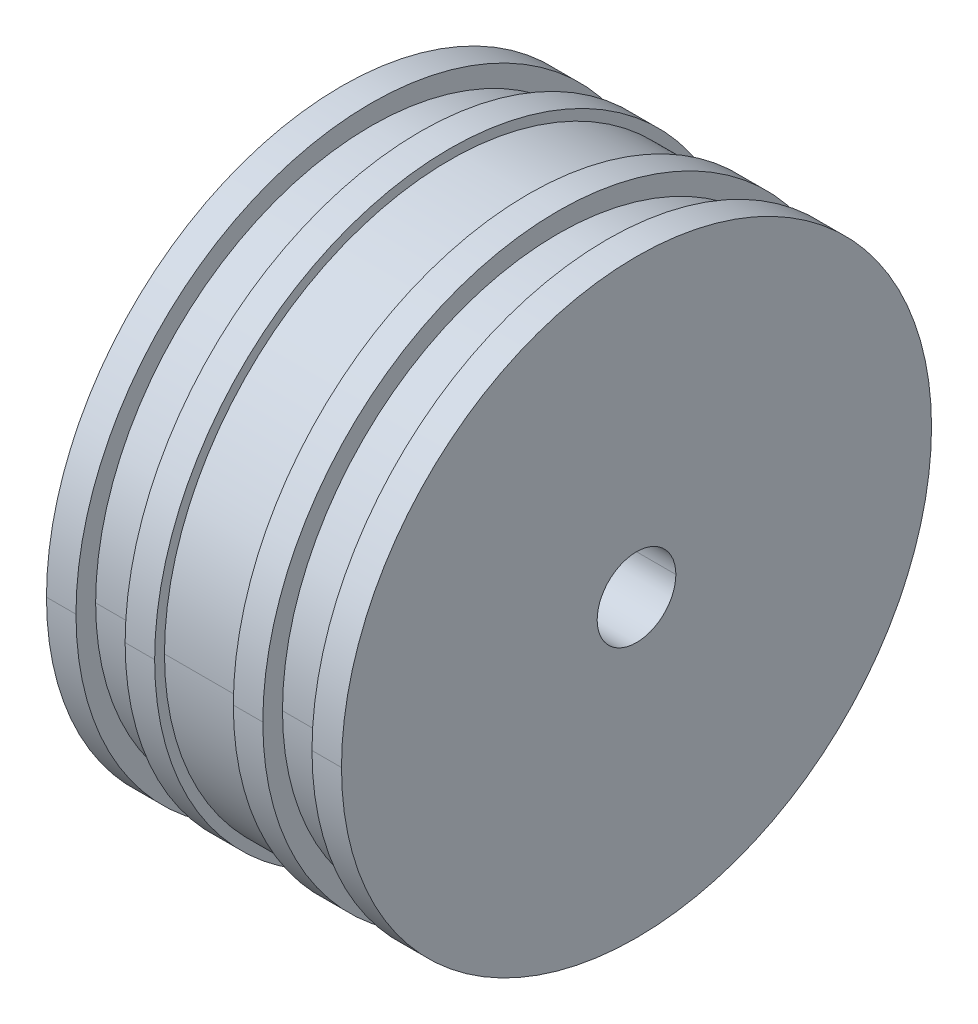
ISO-10303-21;
HEADER;
FILE_DESCRIPTION(('STEP AP214'),'2;1');
FILE_NAME('part.step','',(''),(''),'','','');
FILE_SCHEMA(('AUTOMOTIVE_DESIGN { 1 0 10303 214 1 1 1 1 }'));
ENDSEC;
DATA;
#1=APPLICATION_CONTEXT('core data for automotive mechanical design processes');
#2=APPLICATION_PROTOCOL_DEFINITION('international standard','automotive_design',2000,#1);
#3=PRODUCT_CONTEXT('',#1,'mechanical');
#4=PRODUCT('Part','Part','',(#3));
#5=PRODUCT_RELATED_PRODUCT_CATEGORY('part','',(#4));
#6=PRODUCT_DEFINITION_FORMATION('','',#4);
#7=PRODUCT_DEFINITION_CONTEXT('part definition',#1,'design');
#8=PRODUCT_DEFINITION('design','',#6,#7);
#9=PRODUCT_DEFINITION_SHAPE('','',#8);
#10=(LENGTH_UNIT() NAMED_UNIT(*) SI_UNIT(.MILLI.,.METRE.));
#11=(NAMED_UNIT(*) PLANE_ANGLE_UNIT() SI_UNIT($,.RADIAN.));
#12=(NAMED_UNIT(*) SI_UNIT($,.STERADIAN.) SOLID_ANGLE_UNIT());
#13=UNCERTAINTY_MEASURE_WITH_UNIT(LENGTH_MEASURE(1.E-05),#10,'distance_accuracy_value','');
#14=(GEOMETRIC_REPRESENTATION_CONTEXT(3) GLOBAL_UNCERTAINTY_ASSIGNED_CONTEXT((#13)) GLOBAL_UNIT_ASSIGNED_CONTEXT((#10,
#11,#12)) REPRESENTATION_CONTEXT('',''));
#15=CARTESIAN_POINT('',(0.,0.,0.));
#16=DIRECTION('',(0.,0.,1.));
#17=DIRECTION('',(1.,0.,0.));
#18=AXIS2_PLACEMENT_3D('',#15,#16,#17);
#19=CARTESIAN_POINT('',(-15.,0.,0.));
#20=DIRECTION('',(-1.,0.,0.));
#21=DIRECTION('',(0.,0.,1.));
#22=AXIS2_PLACEMENT_3D('',#19,#20,#21);
#23=CYLINDRICAL_SURFACE('',#22,4.);
#24=DIRECTION('',(-1.,0.,0.));
#25=VECTOR('',#24,1.);
#26=CARTESIAN_POINT('',(-15.,0.,-4.));
#27=LINE('',#26,#25);
#28=CARTESIAN_POINT('',(-10.,0.,-4.));
#29=VERTEX_POINT('',#28);
#30=CARTESIAN_POINT('',(-15.,0.,-4.));
#31=VERTEX_POINT('',#30);
#32=EDGE_CURVE('E280',#29,#31,#27,.T.);
#33=ORIENTED_EDGE('',*,*,#32,.F.);
#34=CARTESIAN_POINT('',(-10.,0.,0.));
#35=DIRECTION('',(-1.,0.,0.));
#36=DIRECTION('',(0.,0.,1.));
#37=AXIS2_PLACEMENT_3D('',#34,#35,#36);
#38=CIRCLE('',#37,4.);
#39=CARTESIAN_POINT('',(-10.,0.,4.));
#40=VERTEX_POINT('',#39);
#41=EDGE_CURVE('E11',#40,#29,#38,.T.);
#42=ORIENTED_EDGE('',*,*,#41,.F.);
#43=DIRECTION('',(-1.,0.,0.));
#44=VECTOR('',#43,1.);
#45=CARTESIAN_POINT('',(-15.,0.,4.));
#46=LINE('',#45,#44);
#47=CARTESIAN_POINT('',(-15.,0.,4.));
#48=VERTEX_POINT('',#47);
#49=EDGE_CURVE('E222',#40,#48,#46,.T.);
#50=ORIENTED_EDGE('',*,*,#49,.T.);
#51=CARTESIAN_POINT('',(-15.,0.,0.));
#52=DIRECTION('',(-1.,0.,0.));
#53=DIRECTION('',(0.,0.,1.));
#54=AXIS2_PLACEMENT_3D('',#51,#52,#53);
#55=CIRCLE('',#54,4.);
#56=EDGE_CURVE('E275',#48,#31,#55,.T.);
#57=ORIENTED_EDGE('',*,*,#56,.T.);
#58=EDGE_LOOP('',(#33,#42,#50,#57));
#59=FACE_BOUND('',#58,.T.);
#60=ADVANCED_FACE('F16',(#59),#23,.F.);
#61=CARTESIAN_POINT('',(-10.,4.,0.));
#62=DIRECTION('',(-1.,0.,0.));
#63=DIRECTION('',(0.,0.,1.));
#64=AXIS2_PLACEMENT_3D('',#61,#62,#63);
#65=PLANE('',#64);
#66=ORIENTED_EDGE('',*,*,#41,.T.);
#67=CARTESIAN_POINT('',(-10.,0.,0.));
#68=DIRECTION('',(-1.,0.,0.));
#69=DIRECTION('',(0.,0.,1.));
#70=AXIS2_PLACEMENT_3D('',#67,#68,#69);
#71=CIRCLE('',#70,4.);
#72=EDGE_CURVE('E277',#29,#40,#71,.T.);
#73=ORIENTED_EDGE('',*,*,#72,.T.);
#74=EDGE_LOOP('',(#66,#73));
#75=FACE_BOUND('',#74,.T.);
#76=CARTESIAN_POINT('',(-10.,0.,0.));
#77=DIRECTION('',(-1.,0.,0.));
#78=DIRECTION('',(0.,0.,1.));
#79=AXIS2_PLACEMENT_3D('',#76,#77,#78);
#80=CIRCLE('',#79,6.);
#81=CARTESIAN_POINT('',(-10.,0.,6.));
#82=VERTEX_POINT('',#81);
#83=CARTESIAN_POINT('',(-10.,0.,-6.));
#84=VERTEX_POINT('',#83);
#85=EDGE_CURVE('E27',#82,#84,#80,.T.);
#86=ORIENTED_EDGE('',*,*,#85,.F.);
#87=CARTESIAN_POINT('',(-10.,0.,0.));
#88=DIRECTION('',(-1.,0.,0.));
#89=DIRECTION('',(0.,0.,1.));
#90=AXIS2_PLACEMENT_3D('',#87,#88,#89);
#91=CIRCLE('',#90,6.);
#92=EDGE_CURVE('E251',#84,#82,#91,.T.);
#93=ORIENTED_EDGE('',*,*,#92,.F.);
#94=EDGE_LOOP('',(#86,#93));
#95=FACE_BOUND('',#94,.T.);
#96=ADVANCED_FACE('F442',(#75,#95),#65,.F.);
#97=CARTESIAN_POINT('',(-15.,0.,0.));
#98=DIRECTION('',(-1.,0.,0.));
#99=DIRECTION('',(0.,0.,1.));
#100=AXIS2_PLACEMENT_3D('',#97,#98,#99);
#101=CYLINDRICAL_SURFACE('',#100,6.);
#102=DIRECTION('',(-1.,0.,0.));
#103=VECTOR('',#102,1.);
#104=CARTESIAN_POINT('',(-15.,0.,-6.));
#105=LINE('',#104,#103);
#106=CARTESIAN_POINT('',(-8.,0.,-6.));
#107=VERTEX_POINT('',#106);
#108=EDGE_CURVE('E266',#107,#84,#105,.T.);
#109=ORIENTED_EDGE('',*,*,#108,.F.);
#110=CARTESIAN_POINT('',(-8.,0.,0.));
#111=DIRECTION('',(-1.,0.,0.));
#112=DIRECTION('',(0.,0.,1.));
#113=AXIS2_PLACEMENT_3D('',#110,#111,#112);
#114=CIRCLE('',#113,6.);
#115=CARTESIAN_POINT('',(-8.,0.,6.));
#116=VERTEX_POINT('',#115);
#117=EDGE_CURVE('E218',#116,#107,#114,.T.);
#118=ORIENTED_EDGE('',*,*,#117,.F.);
#119=DIRECTION('',(-1.,0.,0.));
#120=VECTOR('',#119,1.);
#121=CARTESIAN_POINT('',(-15.,0.,6.));
#122=LINE('',#121,#120);
#123=EDGE_CURVE('E246',#116,#82,#122,.T.);
#124=ORIENTED_EDGE('',*,*,#123,.T.);
#125=ORIENTED_EDGE('',*,*,#85,.T.);
#126=EDGE_LOOP('',(#109,#118,#124,#125));
#127=FACE_BOUND('',#126,.T.);
#128=ADVANCED_FACE('F448',(#127),#101,.F.);
#129=CARTESIAN_POINT('',(-8.,6.,0.));
#130=DIRECTION('',(1.,0.,0.));
#131=DIRECTION('',(0.,1.,0.));
#132=AXIS2_PLACEMENT_3D('',#129,#130,#131);
#133=PLANE('',#132);
#134=CARTESIAN_POINT('',(-8.,0.,0.));
#135=DIRECTION('',(-1.,0.,0.));
#136=DIRECTION('',(0.,0.,1.));
#137=AXIS2_PLACEMENT_3D('',#134,#135,#136);
#138=CIRCLE('',#137,4.);
#139=CARTESIAN_POINT('',(-8.,0.,4.));
#140=VERTEX_POINT('',#139);
#141=CARTESIAN_POINT('',(-8.,0.,-4.));
#142=VERTEX_POINT('',#141);
#143=EDGE_CURVE('E220',#140,#142,#138,.T.);
#144=ORIENTED_EDGE('',*,*,#143,.F.);
#145=CARTESIAN_POINT('',(-8.,0.,0.));
#146=DIRECTION('',(-1.,0.,0.));
#147=DIRECTION('',(0.,0.,1.));
#148=AXIS2_PLACEMENT_3D('',#145,#146,#147);
#149=CIRCLE('',#148,4.);
#150=EDGE_CURVE('E305',#142,#140,#149,.T.);
#151=ORIENTED_EDGE('',*,*,#150,.F.);
#152=EDGE_LOOP('',(#144,#151));
#153=FACE_BOUND('',#152,.T.);
#154=ORIENTED_EDGE('',*,*,#117,.T.);
#155=CARTESIAN_POINT('',(-8.,0.,0.));
#156=DIRECTION('',(-1.,0.,0.));
#157=DIRECTION('',(0.,0.,1.));
#158=AXIS2_PLACEMENT_3D('',#155,#156,#157);
#159=CIRCLE('',#158,6.);
#160=EDGE_CURVE('E226',#107,#116,#159,.T.);
#161=ORIENTED_EDGE('',*,*,#160,.T.);
#162=EDGE_LOOP('',(#154,#161));
#163=FACE_BOUND('',#162,.T.);
#164=ADVANCED_FACE('F572',(#153,#163),#133,.F.);
#165=CARTESIAN_POINT('',(-15.,0.,0.));
#166=DIRECTION('',(-1.,0.,0.));
#167=DIRECTION('',(0.,0.,1.));
#168=AXIS2_PLACEMENT_3D('',#165,#166,#167);
#169=CYLINDRICAL_SURFACE('',#168,4.);
#170=DIRECTION('',(-1.,0.,0.));
#171=VECTOR('',#170,1.);
#172=CARTESIAN_POINT('',(-15.,0.,-4.));
#173=LINE('',#172,#171);
#174=CARTESIAN_POINT('',(15.,0.,-4.));
#175=VERTEX_POINT('',#174);
#176=EDGE_CURVE('E301',#175,#142,#173,.T.);
#177=ORIENTED_EDGE('',*,*,#176,.F.);
#178=CARTESIAN_POINT('',(15.,0.,0.));
#179=DIRECTION('',(-1.,0.,0.));
#180=DIRECTION('',(0.,0.,1.));
#181=AXIS2_PLACEMENT_3D('',#178,#179,#180);
#182=CIRCLE('',#181,4.);
#183=CARTESIAN_POINT('',(15.,0.,4.));
#184=VERTEX_POINT('',#183);
#185=EDGE_CURVE('E284',#184,#175,#182,.T.);
#186=ORIENTED_EDGE('',*,*,#185,.F.);
#187=DIRECTION('',(-1.,0.,0.));
#188=VECTOR('',#187,1.);
#189=CARTESIAN_POINT('',(-15.,0.,4.));
#190=LINE('',#189,#188);
#191=EDGE_CURVE('E351',#184,#140,#190,.T.);
#192=ORIENTED_EDGE('',*,*,#191,.T.);
#193=ORIENTED_EDGE('',*,*,#143,.T.);
#194=EDGE_LOOP('',(#177,#186,#192,#193));
#195=FACE_BOUND('',#194,.T.);
#196=ADVANCED_FACE('F574',(#195),#169,.F.);
#197=CARTESIAN_POINT('',(15.,30.,0.));
#198=DIRECTION('',(-1.,0.,0.));
#199=DIRECTION('',(0.,0.,1.));
#200=AXIS2_PLACEMENT_3D('',#197,#198,#199);
#201=PLANE('',#200);
#202=ORIENTED_EDGE('',*,*,#185,.T.);
#203=CARTESIAN_POINT('',(15.,0.,0.));
#204=DIRECTION('',(-1.,0.,0.));
#205=DIRECTION('',(0.,0.,1.));
#206=AXIS2_PLACEMENT_3D('',#203,#204,#205);
#207=CIRCLE('',#206,4.);
#208=EDGE_CURVE('E250',#175,#184,#207,.T.);
#209=ORIENTED_EDGE('',*,*,#208,.T.);
#210=EDGE_LOOP('',(#202,#209));
#211=FACE_BOUND('',#210,.T.);
#212=CARTESIAN_POINT('',(15.,0.,0.));
#213=DIRECTION('',(-1.,0.,0.));
#214=DIRECTION('',(0.,0.,1.));
#215=AXIS2_PLACEMENT_3D('',#212,#213,#214);
#216=CIRCLE('',#215,30.);
#217=CARTESIAN_POINT('',(15.,0.,30.));
#218=VERTEX_POINT('',#217);
#219=CARTESIAN_POINT('',(15.,0.,-30.));
#220=VERTEX_POINT('',#219);
#221=EDGE_CURVE('E385',#218,#220,#216,.T.);
#222=ORIENTED_EDGE('',*,*,#221,.F.);
#223=CARTESIAN_POINT('',(15.,0.,0.));
#224=DIRECTION('',(-1.,0.,0.));
#225=DIRECTION('',(0.,0.,1.));
#226=AXIS2_PLACEMENT_3D('',#223,#224,#225);
#227=CIRCLE('',#226,30.);
#228=EDGE_CURVE('E287',#220,#218,#227,.T.);
#229=ORIENTED_EDGE('',*,*,#228,.F.);
#230=EDGE_LOOP('',(#222,#229));
#231=FACE_BOUND('',#230,.T.);
#232=ADVANCED_FACE('F462',(#211,#231),#201,.F.);
#233=CARTESIAN_POINT('',(-15.,0.,0.));
#234=DIRECTION('',(-1.,0.,0.));
#235=DIRECTION('',(0.,0.,1.));
#236=AXIS2_PLACEMENT_3D('',#233,#234,#235);
#237=CYLINDRICAL_SURFACE('',#236,30.);
#238=DIRECTION('',(-1.,0.,0.));
#239=VECTOR('',#238,1.);
#240=CARTESIAN_POINT('',(-15.,0.,-30.));
#241=LINE('',#240,#239);
#242=CARTESIAN_POINT('',(12.,0.,-30.));
#243=VERTEX_POINT('',#242);
#244=EDGE_CURVE('E341',#220,#243,#241,.T.);
#245=ORIENTED_EDGE('',*,*,#244,.F.);
#246=ORIENTED_EDGE('',*,*,#228,.T.);
#247=DIRECTION('',(-1.,0.,0.));
#248=VECTOR('',#247,1.);
#249=CARTESIAN_POINT('',(-15.,0.,30.));
#250=LINE('',#249,#248);
#251=CARTESIAN_POINT('',(12.,0.,30.));
#252=VERTEX_POINT('',#251);
#253=EDGE_CURVE('E232',#218,#252,#250,.T.);
#254=ORIENTED_EDGE('',*,*,#253,.T.);
#255=CARTESIAN_POINT('',(12.,0.,0.));
#256=DIRECTION('',(-1.,0.,0.));
#257=DIRECTION('',(0.,0.,1.));
#258=AXIS2_PLACEMENT_3D('',#255,#256,#257);
#259=CIRCLE('',#258,30.);
#260=EDGE_CURVE('E212',#243,#252,#259,.T.);
#261=ORIENTED_EDGE('',*,*,#260,.F.);
#262=EDGE_LOOP('',(#245,#246,#254,#261));
#263=FACE_BOUND('',#262,.T.);
#264=ADVANCED_FACE('F459',(#263),#237,.T.);
#265=CARTESIAN_POINT('',(12.,28.,0.));
#266=DIRECTION('',(1.,0.,0.));
#267=DIRECTION('',(0.,1.,0.));
#268=AXIS2_PLACEMENT_3D('',#265,#266,#267);
#269=PLANE('',#268);
#270=CARTESIAN_POINT('',(12.,0.,0.));
#271=DIRECTION('',(-1.,0.,0.));
#272=DIRECTION('',(0.,0.,1.));
#273=AXIS2_PLACEMENT_3D('',#270,#271,#272);
#274=CIRCLE('',#273,28.);
#275=CARTESIAN_POINT('',(12.,0.,28.));
#276=VERTEX_POINT('',#275);
#277=CARTESIAN_POINT('',(12.,0.,-28.));
#278=VERTEX_POINT('',#277);
#279=EDGE_CURVE('E228',#276,#278,#274,.T.);
#280=ORIENTED_EDGE('',*,*,#279,.F.);
#281=CARTESIAN_POINT('',(12.,0.,0.));
#282=DIRECTION('',(-1.,0.,0.));
#283=DIRECTION('',(0.,0.,1.));
#284=AXIS2_PLACEMENT_3D('',#281,#282,#283);
#285=CIRCLE('',#284,28.);
#286=EDGE_CURVE('E265',#278,#276,#285,.T.);
#287=ORIENTED_EDGE('',*,*,#286,.F.);
#288=EDGE_LOOP('',(#280,#287));
#289=FACE_BOUND('',#288,.T.);
#290=CARTESIAN_POINT('',(12.,0.,0.));
#291=DIRECTION('',(-1.,0.,0.));
#292=DIRECTION('',(0.,0.,1.));
#293=AXIS2_PLACEMENT_3D('',#290,#291,#292);
#294=CIRCLE('',#293,30.);
#295=EDGE_CURVE('E236',#252,#243,#294,.T.);
#296=ORIENTED_EDGE('',*,*,#295,.T.);
#297=ORIENTED_EDGE('',*,*,#260,.T.);
#298=EDGE_LOOP('',(#296,#297));
#299=FACE_BOUND('',#298,.T.);
#300=ADVANCED_FACE('F437',(#289,#299),#269,.F.);
#301=CARTESIAN_POINT('',(-15.,0.,0.));
#302=DIRECTION('',(-1.,0.,0.));
#303=DIRECTION('',(0.,0.,1.));
#304=AXIS2_PLACEMENT_3D('',#301,#302,#303);
#305=CYLINDRICAL_SURFACE('',#304,28.);
#306=DIRECTION('',(-1.,0.,0.));
#307=VECTOR('',#306,1.);
#308=CARTESIAN_POINT('',(-15.,0.,-28.));
#309=LINE('',#308,#307);
#310=CARTESIAN_POINT('',(7.,0.,-28.));
#311=VERTEX_POINT('',#310);
#312=EDGE_CURVE('E20',#278,#311,#309,.T.);
#313=ORIENTED_EDGE('',*,*,#312,.F.);
#314=ORIENTED_EDGE('',*,*,#286,.T.);
#315=DIRECTION('',(-1.,0.,0.));
#316=VECTOR('',#315,1.);
#317=CARTESIAN_POINT('',(-15.,0.,28.));
#318=LINE('',#317,#316);
#319=CARTESIAN_POINT('',(7.,0.,28.));
#320=VERTEX_POINT('',#319);
#321=EDGE_CURVE('E310',#276,#320,#318,.T.);
#322=ORIENTED_EDGE('',*,*,#321,.T.);
#323=CARTESIAN_POINT('',(7.,0.,0.));
#324=DIRECTION('',(-1.,0.,0.));
#325=DIRECTION('',(0.,0.,1.));
#326=AXIS2_PLACEMENT_3D('',#323,#324,#325);
#327=CIRCLE('',#326,28.);
#328=EDGE_CURVE('E262',#311,#320,#327,.T.);
#329=ORIENTED_EDGE('',*,*,#328,.F.);
#330=EDGE_LOOP('',(#313,#314,#322,#329));
#331=FACE_BOUND('',#330,.T.);
#332=ADVANCED_FACE('F427',(#331),#305,.T.);
#333=CARTESIAN_POINT('',(7.,30.,0.));
#334=DIRECTION('',(-1.,0.,0.));
#335=DIRECTION('',(0.,0.,1.));
#336=AXIS2_PLACEMENT_3D('',#333,#334,#335);
#337=PLANE('',#336);
#338=CARTESIAN_POINT('',(7.,0.,0.));
#339=DIRECTION('',(-1.,0.,0.));
#340=DIRECTION('',(0.,0.,1.));
#341=AXIS2_PLACEMENT_3D('',#338,#339,#340);
#342=CIRCLE('',#341,28.);
#343=EDGE_CURVE('E306',#320,#311,#342,.T.);
#344=ORIENTED_EDGE('',*,*,#343,.T.);
#345=ORIENTED_EDGE('',*,*,#328,.T.);
#346=EDGE_LOOP('',(#344,#345));
#347=FACE_BOUND('',#346,.T.);
#348=CARTESIAN_POINT('',(7.,0.,0.));
#349=DIRECTION('',(-1.,0.,0.));
#350=DIRECTION('',(0.,0.,1.));
#351=AXIS2_PLACEMENT_3D('',#348,#349,#350);
#352=CIRCLE('',#351,30.);
#353=CARTESIAN_POINT('',(7.,0.,30.));
#354=VERTEX_POINT('',#353);
#355=CARTESIAN_POINT('',(7.,0.,-30.));
#356=VERTEX_POINT('',#355);
#357=EDGE_CURVE('E338',#354,#356,#352,.T.);
#358=ORIENTED_EDGE('',*,*,#357,.F.);
#359=CARTESIAN_POINT('',(7.,0.,0.));
#360=DIRECTION('',(-1.,0.,0.));
#361=DIRECTION('',(0.,0.,1.));
#362=AXIS2_PLACEMENT_3D('',#359,#360,#361);
#363=CIRCLE('',#362,30.);
#364=EDGE_CURVE('E216',#356,#354,#363,.T.);
#365=ORIENTED_EDGE('',*,*,#364,.F.);
#366=EDGE_LOOP('',(#358,#365));
#367=FACE_BOUND('',#366,.T.);
#368=ADVANCED_FACE('F425',(#347,#367),#337,.F.);
#369=CARTESIAN_POINT('',(-15.,0.,0.));
#370=DIRECTION('',(-1.,0.,0.));
#371=DIRECTION('',(0.,0.,1.));
#372=AXIS2_PLACEMENT_3D('',#369,#370,#371);
#373=CYLINDRICAL_SURFACE('',#372,30.);
#374=DIRECTION('',(-1.,0.,0.));
#375=VECTOR('',#374,1.);
#376=CARTESIAN_POINT('',(-15.,0.,-30.));
#377=LINE('',#376,#375);
#378=CARTESIAN_POINT('',(4.,0.,-30.));
#379=VERTEX_POINT('',#378);
#380=EDGE_CURVE('E300',#356,#379,#377,.T.);
#381=ORIENTED_EDGE('',*,*,#380,.F.);
#382=ORIENTED_EDGE('',*,*,#364,.T.);
#383=DIRECTION('',(-1.,0.,0.));
#384=VECTOR('',#383,1.);
#385=CARTESIAN_POINT('',(-15.,0.,30.));
#386=LINE('',#385,#384);
#387=CARTESIAN_POINT('',(4.,0.,30.));
#388=VERTEX_POINT('',#387);
#389=EDGE_CURVE('E299',#354,#388,#386,.T.);
#390=ORIENTED_EDGE('',*,*,#389,.T.);
#391=CARTESIAN_POINT('',(4.,0.,0.));
#392=DIRECTION('',(-1.,0.,0.));
#393=DIRECTION('',(0.,0.,1.));
#394=AXIS2_PLACEMENT_3D('',#391,#392,#393);
#395=CIRCLE('',#394,30.);
#396=EDGE_CURVE('E214',#379,#388,#395,.T.);
#397=ORIENTED_EDGE('',*,*,#396,.F.);
#398=EDGE_LOOP('',(#381,#382,#390,#397));
#399=FACE_BOUND('',#398,.T.);
#400=ADVANCED_FACE('F416',(#399),#373,.T.);
#401=CARTESIAN_POINT('',(4.,29.,0.));
#402=DIRECTION('',(1.,0.,0.));
#403=DIRECTION('',(0.,1.,0.));
#404=AXIS2_PLACEMENT_3D('',#401,#402,#403);
#405=PLANE('',#404);
#406=CARTESIAN_POINT('',(4.,0.,0.));
#407=DIRECTION('',(-1.,0.,0.));
#408=DIRECTION('',(0.,0.,1.));
#409=AXIS2_PLACEMENT_3D('',#406,#407,#408);
#410=CIRCLE('',#409,29.);
#411=CARTESIAN_POINT('',(4.,0.,29.));
#412=VERTEX_POINT('',#411);
#413=CARTESIAN_POINT('',(4.,0.,-29.));
#414=VERTEX_POINT('',#413);
#415=EDGE_CURVE('E242',#412,#414,#410,.T.);
#416=ORIENTED_EDGE('',*,*,#415,.F.);
#417=CARTESIAN_POINT('',(4.,0.,0.));
#418=DIRECTION('',(-1.,0.,0.));
#419=DIRECTION('',(0.,0.,1.));
#420=AXIS2_PLACEMENT_3D('',#417,#418,#419);
#421=CIRCLE('',#420,29.);
#422=EDGE_CURVE('E217',#414,#412,#421,.T.);
#423=ORIENTED_EDGE('',*,*,#422,.F.);
#424=EDGE_LOOP('',(#416,#423));
#425=FACE_BOUND('',#424,.T.);
#426=CARTESIAN_POINT('',(4.,0.,0.));
#427=DIRECTION('',(-1.,0.,0.));
#428=DIRECTION('',(0.,0.,1.));
#429=AXIS2_PLACEMENT_3D('',#426,#427,#428);
#430=CIRCLE('',#429,30.);
#431=EDGE_CURVE('E295',#388,#379,#430,.T.);
#432=ORIENTED_EDGE('',*,*,#431,.T.);
#433=ORIENTED_EDGE('',*,*,#396,.T.);
#434=EDGE_LOOP('',(#432,#433));
#435=FACE_BOUND('',#434,.T.);
#436=ADVANCED_FACE('F435',(#425,#435),#405,.F.);
#437=CARTESIAN_POINT('',(-15.,0.,0.));
#438=DIRECTION('',(-1.,0.,0.));
#439=DIRECTION('',(0.,0.,1.));
#440=AXIS2_PLACEMENT_3D('',#437,#438,#439);
#441=CYLINDRICAL_SURFACE('',#440,29.);
#442=DIRECTION('',(-1.,0.,0.));
#443=VECTOR('',#442,1.);
#444=CARTESIAN_POINT('',(-15.,0.,-29.));
#445=LINE('',#444,#443);
#446=CARTESIAN_POINT('',(-4.,0.,-29.));
#447=VERTEX_POINT('',#446);
#448=EDGE_CURVE('E237',#414,#447,#445,.T.);
#449=ORIENTED_EDGE('',*,*,#448,.F.);
#450=ORIENTED_EDGE('',*,*,#422,.T.);
#451=DIRECTION('',(-1.,0.,0.));
#452=VECTOR('',#451,1.);
#453=CARTESIAN_POINT('',(-15.,0.,29.));
#454=LINE('',#453,#452);
#455=CARTESIAN_POINT('',(-4.,0.,29.));
#456=VERTEX_POINT('',#455);
#457=EDGE_CURVE('E272',#412,#456,#454,.T.);
#458=ORIENTED_EDGE('',*,*,#457,.T.);
#459=CARTESIAN_POINT('',(-4.,0.,0.));
#460=DIRECTION('',(-1.,0.,0.));
#461=DIRECTION('',(0.,0.,1.));
#462=AXIS2_PLACEMENT_3D('',#459,#460,#461);
#463=CIRCLE('',#462,29.);
#464=EDGE_CURVE('E168',#447,#456,#463,.T.);
#465=ORIENTED_EDGE('',*,*,#464,.F.);
#466=EDGE_LOOP('',(#449,#450,#458,#465));
#467=FACE_BOUND('',#466,.T.);
#468=ADVANCED_FACE('F18',(#467),#441,.T.);
#469=CARTESIAN_POINT('',(-4.,30.,0.));
#470=DIRECTION('',(-1.,0.,0.));
#471=DIRECTION('',(0.,0.,1.));
#472=AXIS2_PLACEMENT_3D('',#469,#470,#471);
#473=PLANE('',#472);
#474=CARTESIAN_POINT('',(-4.,0.,0.));
#475=DIRECTION('',(-1.,0.,0.));
#476=DIRECTION('',(0.,0.,1.));
#477=AXIS2_PLACEMENT_3D('',#474,#475,#476);
#478=CIRCLE('',#477,29.);
#479=EDGE_CURVE('E241',#456,#447,#478,.T.);
#480=ORIENTED_EDGE('',*,*,#479,.T.);
#481=ORIENTED_EDGE('',*,*,#464,.T.);
#482=EDGE_LOOP('',(#480,#481));
#483=FACE_BOUND('',#482,.T.);
#484=CARTESIAN_POINT('',(-4.,0.,0.));
#485=DIRECTION('',(-1.,0.,0.));
#486=DIRECTION('',(0.,0.,1.));
#487=AXIS2_PLACEMENT_3D('',#484,#485,#486);
#488=CIRCLE('',#487,30.);
#489=CARTESIAN_POINT('',(-4.,0.,30.));
#490=VERTEX_POINT('',#489);
#491=CARTESIAN_POINT('',(-4.,0.,-30.));
#492=VERTEX_POINT('',#491);
#493=EDGE_CURVE('E312',#490,#492,#488,.T.);
#494=ORIENTED_EDGE('',*,*,#493,.F.);
#495=CARTESIAN_POINT('',(-4.,0.,0.));
#496=DIRECTION('',(-1.,0.,0.));
#497=DIRECTION('',(0.,0.,1.));
#498=AXIS2_PLACEMENT_3D('',#495,#496,#497);
#499=CIRCLE('',#498,30.);
#500=EDGE_CURVE('E155',#492,#490,#499,.T.);
#501=ORIENTED_EDGE('',*,*,#500,.F.);
#502=EDGE_LOOP('',(#494,#501));
#503=FACE_BOUND('',#502,.T.);
#504=ADVANCED_FACE('F478',(#483,#503),#473,.F.);
#505=CARTESIAN_POINT('',(-15.,0.,0.));
#506=DIRECTION('',(-1.,0.,0.));
#507=DIRECTION('',(0.,0.,1.));
#508=AXIS2_PLACEMENT_3D('',#505,#506,#507);
#509=CYLINDRICAL_SURFACE('',#508,30.);
#510=DIRECTION('',(-1.,0.,0.));
#511=VECTOR('',#510,1.);
#512=CARTESIAN_POINT('',(-15.,0.,-30.));
#513=LINE('',#512,#511);
#514=CARTESIAN_POINT('',(-7.,0.,-30.));
#515=VERTEX_POINT('',#514);
#516=EDGE_CURVE('E261',#492,#515,#513,.T.);
#517=ORIENTED_EDGE('',*,*,#516,.F.);
#518=ORIENTED_EDGE('',*,*,#500,.T.);
#519=DIRECTION('',(-1.,0.,0.));
#520=VECTOR('',#519,1.);
#521=CARTESIAN_POINT('',(-15.,0.,30.));
#522=LINE('',#521,#520);
#523=CARTESIAN_POINT('',(-7.,0.,30.));
#524=VERTEX_POINT('',#523);
#525=EDGE_CURVE('E260',#490,#524,#522,.T.);
#526=ORIENTED_EDGE('',*,*,#525,.T.);
#527=CARTESIAN_POINT('',(-7.,0.,0.));
#528=DIRECTION('',(-1.,0.,0.));
#529=DIRECTION('',(0.,0.,1.));
#530=AXIS2_PLACEMENT_3D('',#527,#528,#529);
#531=CIRCLE('',#530,30.);
#532=EDGE_CURVE('E245',#515,#524,#531,.T.);
#533=ORIENTED_EDGE('',*,*,#532,.F.);
#534=EDGE_LOOP('',(#517,#518,#526,#533));
#535=FACE_BOUND('',#534,.T.);
#536=ADVANCED_FACE('F470',(#535),#509,.T.);
#537=CARTESIAN_POINT('',(-7.,28.,0.));
#538=DIRECTION('',(1.,0.,0.));
#539=DIRECTION('',(0.,1.,0.));
#540=AXIS2_PLACEMENT_3D('',#537,#538,#539);
#541=PLANE('',#540);
#542=CARTESIAN_POINT('',(-7.,0.,0.));
#543=DIRECTION('',(-1.,0.,0.));
#544=DIRECTION('',(0.,0.,1.));
#545=AXIS2_PLACEMENT_3D('',#542,#543,#544);
#546=CIRCLE('',#545,28.);
#547=CARTESIAN_POINT('',(-7.,0.,28.));
#548=VERTEX_POINT('',#547);
#549=CARTESIAN_POINT('',(-7.,0.,-28.));
#550=VERTEX_POINT('',#549);
#551=EDGE_CURVE('E208',#548,#550,#546,.T.);
#552=ORIENTED_EDGE('',*,*,#551,.F.);
#553=CARTESIAN_POINT('',(-7.,0.,0.));
#554=DIRECTION('',(-1.,0.,0.));
#555=DIRECTION('',(0.,0.,1.));
#556=AXIS2_PLACEMENT_3D('',#553,#554,#555);
#557=CIRCLE('',#556,28.);
#558=EDGE_CURVE('E187',#550,#548,#557,.T.);
#559=ORIENTED_EDGE('',*,*,#558,.F.);
#560=EDGE_LOOP('',(#552,#559));
#561=FACE_BOUND('',#560,.T.);
#562=CARTESIAN_POINT('',(-7.,0.,0.));
#563=DIRECTION('',(-1.,0.,0.));
#564=DIRECTION('',(0.,0.,1.));
#565=AXIS2_PLACEMENT_3D('',#562,#563,#564);
#566=CIRCLE('',#565,30.);
#567=EDGE_CURVE('E256',#524,#515,#566,.T.);
#568=ORIENTED_EDGE('',*,*,#567,.T.);
#569=ORIENTED_EDGE('',*,*,#532,.T.);
#570=EDGE_LOOP('',(#568,#569));
#571=FACE_BOUND('',#570,.T.);
#572=ADVANCED_FACE('F468',(#561,#571),#541,.F.);
#573=CARTESIAN_POINT('',(-15.,0.,0.));
#574=DIRECTION('',(-1.,0.,0.));
#575=DIRECTION('',(0.,0.,1.));
#576=AXIS2_PLACEMENT_3D('',#573,#574,#575);
#577=CYLINDRICAL_SURFACE('',#576,28.);
#578=DIRECTION('',(-1.,0.,0.));
#579=VECTOR('',#578,1.);
#580=CARTESIAN_POINT('',(-15.,0.,-28.));
#581=LINE('',#580,#579);
#582=CARTESIAN_POINT('',(-12.,0.,-28.));
#583=VERTEX_POINT('',#582);
#584=EDGE_CURVE('E200',#550,#583,#581,.T.);
#585=ORIENTED_EDGE('',*,*,#584,.F.);
#586=ORIENTED_EDGE('',*,*,#558,.T.);
#587=DIRECTION('',(-1.,0.,0.));
#588=VECTOR('',#587,1.);
#589=CARTESIAN_POINT('',(-15.,0.,28.));
#590=LINE('',#589,#588);
#591=CARTESIAN_POINT('',(-12.,0.,28.));
#592=VERTEX_POINT('',#591);
#593=EDGE_CURVE('E191',#548,#592,#590,.T.);
#594=ORIENTED_EDGE('',*,*,#593,.T.);
#595=CARTESIAN_POINT('',(-12.,0.,0.));
#596=DIRECTION('',(-1.,0.,0.));
#597=DIRECTION('',(0.,0.,1.));
#598=AXIS2_PLACEMENT_3D('',#595,#596,#597);
#599=CIRCLE('',#598,28.);
#600=EDGE_CURVE('E177',#583,#592,#599,.T.);
#601=ORIENTED_EDGE('',*,*,#600,.F.);
#602=EDGE_LOOP('',(#585,#586,#594,#601));
#603=FACE_BOUND('',#602,.T.);
#604=ADVANCED_FACE('F192',(#603),#577,.T.);
#605=CARTESIAN_POINT('',(-12.,30.,0.));
#606=DIRECTION('',(-1.,0.,0.));
#607=DIRECTION('',(0.,0.,1.));
#608=AXIS2_PLACEMENT_3D('',#605,#606,#607);
#609=PLANE('',#608);
#610=CARTESIAN_POINT('',(-12.,0.,0.));
#611=DIRECTION('',(-1.,0.,0.));
#612=DIRECTION('',(0.,0.,1.));
#613=AXIS2_PLACEMENT_3D('',#610,#611,#612);
#614=CIRCLE('',#613,28.);
#615=EDGE_CURVE('E182',#592,#583,#614,.T.);
#616=ORIENTED_EDGE('',*,*,#615,.T.);
#617=ORIENTED_EDGE('',*,*,#600,.T.);
#618=EDGE_LOOP('',(#616,#617));
#619=FACE_BOUND('',#618,.T.);
#620=CARTESIAN_POINT('',(-12.,0.,0.));
#621=DIRECTION('',(-1.,0.,0.));
#622=DIRECTION('',(0.,0.,1.));
#623=AXIS2_PLACEMENT_3D('',#620,#621,#622);
#624=CIRCLE('',#623,30.);
#625=CARTESIAN_POINT('',(-12.,0.,30.));
#626=VERTEX_POINT('',#625);
#627=CARTESIAN_POINT('',(-12.,0.,-30.));
#628=VERTEX_POINT('',#627);
#629=EDGE_CURVE('E197',#626,#628,#624,.T.);
#630=ORIENTED_EDGE('',*,*,#629,.F.);
#631=CARTESIAN_POINT('',(-12.,0.,0.));
#632=DIRECTION('',(-1.,0.,0.));
#633=DIRECTION('',(0.,0.,1.));
#634=AXIS2_PLACEMENT_3D('',#631,#632,#633);
#635=CIRCLE('',#634,30.);
#636=EDGE_CURVE('E188',#628,#626,#635,.T.);
#637=ORIENTED_EDGE('',*,*,#636,.F.);
#638=EDGE_LOOP('',(#630,#637));
#639=FACE_BOUND('',#638,.T.);
#640=ADVANCED_FACE('F179',(#619,#639),#609,.F.);
#641=CARTESIAN_POINT('',(-15.,0.,0.));
#642=DIRECTION('',(-1.,0.,0.));
#643=DIRECTION('',(0.,0.,1.));
#644=AXIS2_PLACEMENT_3D('',#641,#642,#643);
#645=CYLINDRICAL_SURFACE('',#644,30.);
#646=DIRECTION('',(-1.,0.,0.));
#647=VECTOR('',#646,1.);
#648=CARTESIAN_POINT('',(-15.,0.,-30.));
#649=LINE('',#648,#647);
#650=CARTESIAN_POINT('',(-15.,0.,-30.));
#651=VERTEX_POINT('',#650);
#652=EDGE_CURVE('E255',#628,#651,#649,.T.);
#653=ORIENTED_EDGE('',*,*,#652,.F.);
#654=ORIENTED_EDGE('',*,*,#636,.T.);
#655=DIRECTION('',(-1.,0.,0.));
#656=VECTOR('',#655,1.);
#657=CARTESIAN_POINT('',(-15.,0.,30.));
#658=LINE('',#657,#656);
#659=CARTESIAN_POINT('',(-15.,0.,30.));
#660=VERTEX_POINT('',#659);
#661=EDGE_CURVE('E276',#626,#660,#658,.T.);
#662=ORIENTED_EDGE('',*,*,#661,.T.);
#663=CARTESIAN_POINT('',(-15.,0.,0.));
#664=DIRECTION('',(-1.,0.,0.));
#665=DIRECTION('',(0.,0.,1.));
#666=AXIS2_PLACEMENT_3D('',#663,#664,#665);
#667=CIRCLE('',#666,30.);
#668=EDGE_CURVE('E41',#651,#660,#667,.T.);
#669=ORIENTED_EDGE('',*,*,#668,.F.);
#670=EDGE_LOOP('',(#653,#654,#662,#669));
#671=FACE_BOUND('',#670,.T.);
#672=ADVANCED_FACE('F499',(#671),#645,.T.);
#673=CARTESIAN_POINT('',(-15.,4.,0.));
#674=DIRECTION('',(1.,0.,0.));
#675=DIRECTION('',(0.,1.,0.));
#676=AXIS2_PLACEMENT_3D('',#673,#674,#675);
#677=PLANE('',#676);
#678=ORIENTED_EDGE('',*,*,#56,.F.);
#679=CARTESIAN_POINT('',(-15.,0.,0.));
#680=DIRECTION('',(-1.,0.,0.));
#681=DIRECTION('',(0.,0.,1.));
#682=AXIS2_PLACEMENT_3D('',#679,#680,#681);
#683=CIRCLE('',#682,4.);
#684=EDGE_CURVE('E227',#31,#48,#683,.T.);
#685=ORIENTED_EDGE('',*,*,#684,.F.);
#686=EDGE_LOOP('',(#678,#685));
#687=FACE_BOUND('',#686,.T.);
#688=CARTESIAN_POINT('',(-15.,0.,0.));
#689=DIRECTION('',(-1.,0.,0.));
#690=DIRECTION('',(0.,0.,1.));
#691=AXIS2_PLACEMENT_3D('',#688,#689,#690);
#692=CIRCLE('',#691,30.);
#693=EDGE_CURVE('E377',#660,#651,#692,.T.);
#694=ORIENTED_EDGE('',*,*,#693,.T.);
#695=ORIENTED_EDGE('',*,*,#668,.T.);
#696=EDGE_LOOP('',(#694,#695));
#697=FACE_BOUND('',#696,.T.);
#698=ADVANCED_FACE('F501',(#687,#697),#677,.F.);
#699=CARTESIAN_POINT('',(-15.,0.,0.));
#700=DIRECTION('',(-1.,0.,0.));
#701=DIRECTION('',(0.,0.,1.));
#702=AXIS2_PLACEMENT_3D('',#699,#700,#701);
#703=CYLINDRICAL_SURFACE('',#702,30.);
#704=ORIENTED_EDGE('',*,*,#629,.T.);
#705=ORIENTED_EDGE('',*,*,#652,.T.);
#706=ORIENTED_EDGE('',*,*,#693,.F.);
#707=ORIENTED_EDGE('',*,*,#661,.F.);
#708=EDGE_LOOP('',(#704,#705,#706,#707));
#709=FACE_BOUND('',#708,.T.);
#710=ADVANCED_FACE('F465',(#709),#703,.T.);
#711=CARTESIAN_POINT('',(-15.,0.,0.));
#712=DIRECTION('',(-1.,0.,0.));
#713=DIRECTION('',(0.,0.,1.));
#714=AXIS2_PLACEMENT_3D('',#711,#712,#713);
#715=CYLINDRICAL_SURFACE('',#714,28.);
#716=ORIENTED_EDGE('',*,*,#551,.T.);
#717=ORIENTED_EDGE('',*,*,#584,.T.);
#718=ORIENTED_EDGE('',*,*,#615,.F.);
#719=ORIENTED_EDGE('',*,*,#593,.F.);
#720=EDGE_LOOP('',(#716,#717,#718,#719));
#721=FACE_BOUND('',#720,.T.);
#722=ADVANCED_FACE('F199',(#721),#715,.T.);
#723=CARTESIAN_POINT('',(-15.,0.,0.));
#724=DIRECTION('',(-1.,0.,0.));
#725=DIRECTION('',(0.,0.,1.));
#726=AXIS2_PLACEMENT_3D('',#723,#724,#725);
#727=CYLINDRICAL_SURFACE('',#726,30.);
#728=ORIENTED_EDGE('',*,*,#493,.T.);
#729=ORIENTED_EDGE('',*,*,#516,.T.);
#730=ORIENTED_EDGE('',*,*,#567,.F.);
#731=ORIENTED_EDGE('',*,*,#525,.F.);
#732=EDGE_LOOP('',(#728,#729,#730,#731));
#733=FACE_BOUND('',#732,.T.);
#734=ADVANCED_FACE('F457',(#733),#727,.T.);
#735=CARTESIAN_POINT('',(-15.,0.,0.));
#736=DIRECTION('',(-1.,0.,0.));
#737=DIRECTION('',(0.,0.,1.));
#738=AXIS2_PLACEMENT_3D('',#735,#736,#737);
#739=CYLINDRICAL_SURFACE('',#738,29.);
#740=ORIENTED_EDGE('',*,*,#415,.T.);
#741=ORIENTED_EDGE('',*,*,#448,.T.);
#742=ORIENTED_EDGE('',*,*,#479,.F.);
#743=ORIENTED_EDGE('',*,*,#457,.F.);
#744=EDGE_LOOP('',(#740,#741,#742,#743));
#745=FACE_BOUND('',#744,.T.);
#746=ADVANCED_FACE('F454',(#745),#739,.T.);
#747=CARTESIAN_POINT('',(-15.,0.,0.));
#748=DIRECTION('',(-1.,0.,0.));
#749=DIRECTION('',(0.,0.,1.));
#750=AXIS2_PLACEMENT_3D('',#747,#748,#749);
#751=CYLINDRICAL_SURFACE('',#750,30.);
#752=ORIENTED_EDGE('',*,*,#357,.T.);
#753=ORIENTED_EDGE('',*,*,#380,.T.);
#754=ORIENTED_EDGE('',*,*,#431,.F.);
#755=ORIENTED_EDGE('',*,*,#389,.F.);
#756=EDGE_LOOP('',(#752,#753,#754,#755));
#757=FACE_BOUND('',#756,.T.);
#758=ADVANCED_FACE('F424',(#757),#751,.T.);
#759=CARTESIAN_POINT('',(-15.,0.,0.));
#760=DIRECTION('',(-1.,0.,0.));
#761=DIRECTION('',(0.,0.,1.));
#762=AXIS2_PLACEMENT_3D('',#759,#760,#761);
#763=CYLINDRICAL_SURFACE('',#762,28.);
#764=ORIENTED_EDGE('',*,*,#279,.T.);
#765=ORIENTED_EDGE('',*,*,#312,.T.);
#766=ORIENTED_EDGE('',*,*,#343,.F.);
#767=ORIENTED_EDGE('',*,*,#321,.F.);
#768=EDGE_LOOP('',(#764,#765,#766,#767));
#769=FACE_BOUND('',#768,.T.);
#770=ADVANCED_FACE('F498',(#769),#763,.T.);
#771=CARTESIAN_POINT('',(-15.,0.,0.));
#772=DIRECTION('',(-1.,0.,0.));
#773=DIRECTION('',(0.,0.,1.));
#774=AXIS2_PLACEMENT_3D('',#771,#772,#773);
#775=CYLINDRICAL_SURFACE('',#774,30.);
#776=ORIENTED_EDGE('',*,*,#221,.T.);
#777=ORIENTED_EDGE('',*,*,#244,.T.);
#778=ORIENTED_EDGE('',*,*,#295,.F.);
#779=ORIENTED_EDGE('',*,*,#253,.F.);
#780=EDGE_LOOP('',(#776,#777,#778,#779));
#781=FACE_BOUND('',#780,.T.);
#782=ADVANCED_FACE('F494',(#781),#775,.T.);
#783=CARTESIAN_POINT('',(-15.,0.,0.));
#784=DIRECTION('',(-1.,0.,0.));
#785=DIRECTION('',(0.,0.,1.));
#786=AXIS2_PLACEMENT_3D('',#783,#784,#785);
#787=CYLINDRICAL_SURFACE('',#786,4.);
#788=ORIENTED_EDGE('',*,*,#208,.F.);
#789=ORIENTED_EDGE('',*,*,#176,.T.);
#790=ORIENTED_EDGE('',*,*,#150,.T.);
#791=ORIENTED_EDGE('',*,*,#191,.F.);
#792=EDGE_LOOP('',(#788,#789,#790,#791));
#793=FACE_BOUND('',#792,.T.);
#794=ADVANCED_FACE('F585',(#793),#787,.F.);
#795=CARTESIAN_POINT('',(-15.,0.,0.));
#796=DIRECTION('',(-1.,0.,0.));
#797=DIRECTION('',(0.,0.,1.));
#798=AXIS2_PLACEMENT_3D('',#795,#796,#797);
#799=CYLINDRICAL_SURFACE('',#798,6.);
#800=ORIENTED_EDGE('',*,*,#160,.F.);
#801=ORIENTED_EDGE('',*,*,#108,.T.);
#802=ORIENTED_EDGE('',*,*,#92,.T.);
#803=ORIENTED_EDGE('',*,*,#123,.F.);
#804=EDGE_LOOP('',(#800,#801,#802,#803));
#805=FACE_BOUND('',#804,.T.);
#806=ADVANCED_FACE('F475',(#805),#799,.F.);
#807=CARTESIAN_POINT('',(-15.,0.,0.));
#808=DIRECTION('',(-1.,0.,0.));
#809=DIRECTION('',(0.,0.,1.));
#810=AXIS2_PLACEMENT_3D('',#807,#808,#809);
#811=CYLINDRICAL_SURFACE('',#810,4.);
#812=ORIENTED_EDGE('',*,*,#72,.F.);
#813=ORIENTED_EDGE('',*,*,#32,.T.);
#814=ORIENTED_EDGE('',*,*,#684,.T.);
#815=ORIENTED_EDGE('',*,*,#49,.F.);
#816=EDGE_LOOP('',(#812,#813,#814,#815));
#817=FACE_BOUND('',#816,.T.);
#818=ADVANCED_FACE('F473',(#817),#811,.F.);
#819=CLOSED_SHELL('',(#60,#96,#128,#164,#196,#232,#264,#300,#332,#368,#400,#436,#468,#504,#536,
#572,#604,#640,#672,#698,#710,#722,#734,#746,#758,#770,#782,#794,#806,#818));
#820=MANIFOLD_SOLID_BREP('B1',#819);
#821=ADVANCED_BREP_SHAPE_REPRESENTATION('',(#18,#820),#14);
#822=SHAPE_DEFINITION_REPRESENTATION(#9,#821);
ENDSEC;
END-ISO-10303-21;
